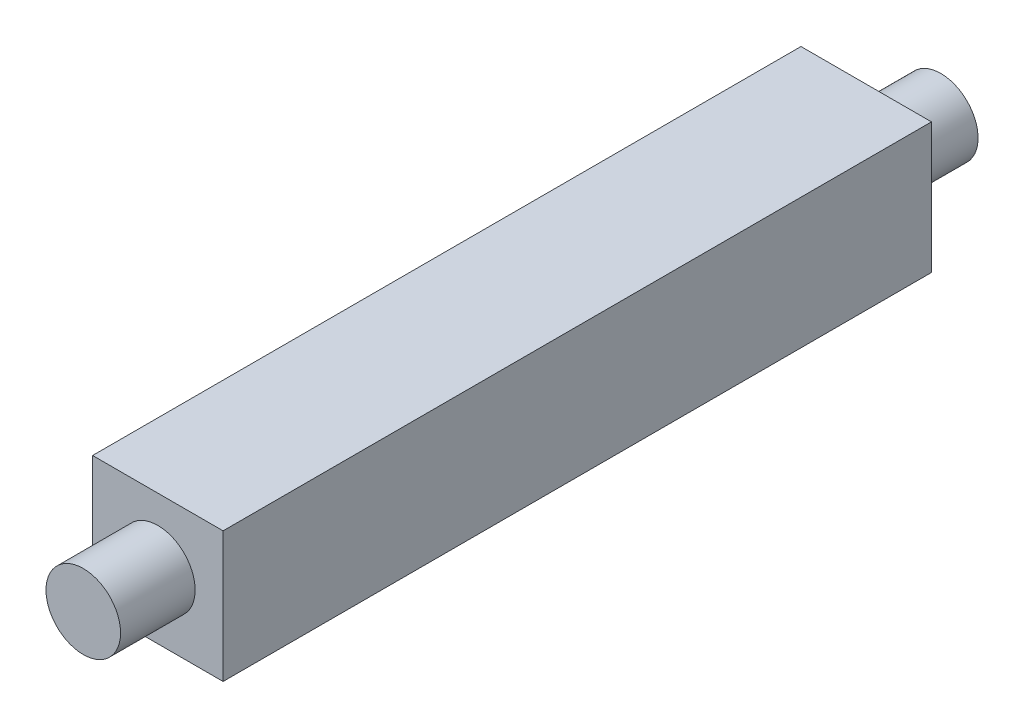
ISO-10303-21;
HEADER;
FILE_DESCRIPTION(('STEP AP214'),'2;1');
FILE_NAME('part.step','',(''),(''),'','','');
FILE_SCHEMA(('AUTOMOTIVE_DESIGN { 1 0 10303 214 1 1 1 1 }'));
ENDSEC;
DATA;
#1=APPLICATION_CONTEXT('core data for automotive mechanical design processes');
#2=APPLICATION_PROTOCOL_DEFINITION('international standard','automotive_design',2000,#1);
#3=PRODUCT_CONTEXT('',#1,'mechanical');
#4=PRODUCT('Part','Part','',(#3));
#5=PRODUCT_RELATED_PRODUCT_CATEGORY('part','',(#4));
#6=PRODUCT_DEFINITION_FORMATION('','',#4);
#7=PRODUCT_DEFINITION_CONTEXT('part definition',#1,'design');
#8=PRODUCT_DEFINITION('design','',#6,#7);
#9=PRODUCT_DEFINITION_SHAPE('','',#8);
#10=(LENGTH_UNIT() NAMED_UNIT(*) SI_UNIT(.MILLI.,.METRE.));
#11=(NAMED_UNIT(*) PLANE_ANGLE_UNIT() SI_UNIT($,.RADIAN.));
#12=(NAMED_UNIT(*) SI_UNIT($,.STERADIAN.) SOLID_ANGLE_UNIT());
#13=UNCERTAINTY_MEASURE_WITH_UNIT(LENGTH_MEASURE(1.E-05),#10,'distance_accuracy_value','');
#14=(GEOMETRIC_REPRESENTATION_CONTEXT(3) GLOBAL_UNCERTAINTY_ASSIGNED_CONTEXT((#13)) GLOBAL_UNIT_ASSIGNED_CONTEXT((#10,
#11,#12)) REPRESENTATION_CONTEXT('',''));
#15=CARTESIAN_POINT('',(0.,0.,0.));
#16=DIRECTION('',(0.,0.,1.));
#17=DIRECTION('',(1.,0.,0.));
#18=AXIS2_PLACEMENT_3D('',#15,#16,#17);
#19=CARTESIAN_POINT('',(1.75,-1.75,19.));
#20=DIRECTION('',(-1.,0.,0.));
#21=DIRECTION('',(0.,0.,1.));
#22=AXIS2_PLACEMENT_3D('',#19,#20,#21);
#23=PLANE('',#22);
#24=DIRECTION('',(0.,1.,0.));
#25=VECTOR('',#24,1.);
#26=CARTESIAN_POINT('',(1.75,-1.75,0.));
#27=LINE('',#26,#25);
#28=CARTESIAN_POINT('',(1.75,-1.75,0.));
#29=VERTEX_POINT('',#28);
#30=CARTESIAN_POINT('',(1.75,1.75,0.));
#31=VERTEX_POINT('',#30);
#32=EDGE_CURVE('E99',#29,#31,#27,.T.);
#33=ORIENTED_EDGE('',*,*,#32,.T.);
#34=DIRECTION('',(0.,0.,-1.));
#35=VECTOR('',#34,1.);
#36=CARTESIAN_POINT('',(1.75,1.75,19.));
#37=LINE('',#36,#35);
#38=CARTESIAN_POINT('',(1.75,1.75,19.));
#39=VERTEX_POINT('',#38);
#40=EDGE_CURVE('E41',#39,#31,#37,.T.);
#41=ORIENTED_EDGE('',*,*,#40,.F.);
#42=DIRECTION('',(0.,1.,0.));
#43=VECTOR('',#42,1.);
#44=CARTESIAN_POINT('',(1.75,-1.75,19.));
#45=LINE('',#44,#43);
#46=CARTESIAN_POINT('',(1.75,-1.75,19.));
#47=VERTEX_POINT('',#46);
#48=EDGE_CURVE('E85',#47,#39,#45,.T.);
#49=ORIENTED_EDGE('',*,*,#48,.F.);
#50=DIRECTION('',(0.,0.,-1.));
#51=VECTOR('',#50,1.);
#52=CARTESIAN_POINT('',(1.75,-1.75,19.));
#53=LINE('',#52,#51);
#54=EDGE_CURVE('E95',#47,#29,#53,.T.);
#55=ORIENTED_EDGE('',*,*,#54,.T.);
#56=EDGE_LOOP('',(#33,#41,#49,#55));
#57=FACE_BOUND('',#56,.T.);
#58=ADVANCED_FACE('F33',(#57),#23,.F.);
#59=CARTESIAN_POINT('',(-1.75,1.75,19.));
#60=DIRECTION('',(0.,-1.,0.));
#61=DIRECTION('',(0.,0.,-1.));
#62=AXIS2_PLACEMENT_3D('',#59,#60,#61);
#63=PLANE('',#62);
#64=DIRECTION('',(-1.,0.,0.));
#65=VECTOR('',#64,1.);
#66=CARTESIAN_POINT('',(-1.75,1.75,0.));
#67=LINE('',#66,#65);
#68=CARTESIAN_POINT('',(-1.75,1.75,0.));
#69=VERTEX_POINT('',#68);
#70=EDGE_CURVE('E90',#31,#69,#67,.T.);
#71=ORIENTED_EDGE('',*,*,#70,.T.);
#72=DIRECTION('',(0.,0.,-1.));
#73=VECTOR('',#72,1.);
#74=CARTESIAN_POINT('',(-1.75,1.75,19.));
#75=LINE('',#74,#73);
#76=CARTESIAN_POINT('',(-1.75,1.75,19.));
#77=VERTEX_POINT('',#76);
#78=EDGE_CURVE('E88',#77,#69,#75,.T.);
#79=ORIENTED_EDGE('',*,*,#78,.F.);
#80=DIRECTION('',(-1.,0.,0.));
#81=VECTOR('',#80,1.);
#82=CARTESIAN_POINT('',(-1.75,1.75,19.));
#83=LINE('',#82,#81);
#84=EDGE_CURVE('E80',#39,#77,#83,.T.);
#85=ORIENTED_EDGE('',*,*,#84,.F.);
#86=ORIENTED_EDGE('',*,*,#40,.T.);
#87=EDGE_LOOP('',(#71,#79,#85,#86));
#88=FACE_BOUND('',#87,.T.);
#89=ADVANCED_FACE('F89',(#88),#63,.F.);
#90=CARTESIAN_POINT('',(-1.75,-1.75,19.));
#91=DIRECTION('',(1.,0.,0.));
#92=DIRECTION('',(0.,0.,-1.));
#93=AXIS2_PLACEMENT_3D('',#90,#91,#92);
#94=PLANE('',#93);
#95=DIRECTION('',(0.,-1.,0.));
#96=VECTOR('',#95,1.);
#97=CARTESIAN_POINT('',(-1.75,-1.75,0.));
#98=LINE('',#97,#96);
#99=CARTESIAN_POINT('',(-1.75,-1.75,0.));
#100=VERTEX_POINT('',#99);
#101=EDGE_CURVE('E66',#69,#100,#98,.T.);
#102=ORIENTED_EDGE('',*,*,#101,.T.);
#103=DIRECTION('',(0.,0.,-1.));
#104=VECTOR('',#103,1.);
#105=CARTESIAN_POINT('',(-1.75,-1.75,19.));
#106=LINE('',#105,#104);
#107=CARTESIAN_POINT('',(-1.75,-1.75,19.));
#108=VERTEX_POINT('',#107);
#109=EDGE_CURVE('E91',#108,#100,#106,.T.);
#110=ORIENTED_EDGE('',*,*,#109,.F.);
#111=DIRECTION('',(0.,-1.,0.));
#112=VECTOR('',#111,1.);
#113=CARTESIAN_POINT('',(-1.75,-1.75,19.));
#114=LINE('',#113,#112);
#115=EDGE_CURVE('E83',#77,#108,#114,.T.);
#116=ORIENTED_EDGE('',*,*,#115,.F.);
#117=ORIENTED_EDGE('',*,*,#78,.T.);
#118=EDGE_LOOP('',(#102,#110,#116,#117));
#119=FACE_BOUND('',#118,.T.);
#120=ADVANCED_FACE('F93',(#119),#94,.F.);
#121=CARTESIAN_POINT('',(-1.75,-1.75,19.));
#122=DIRECTION('',(0.,1.,0.));
#123=DIRECTION('',(0.,0.,1.));
#124=AXIS2_PLACEMENT_3D('',#121,#122,#123);
#125=PLANE('',#124);
#126=DIRECTION('',(1.,0.,0.));
#127=VECTOR('',#126,1.);
#128=CARTESIAN_POINT('',(-1.75,-1.75,0.));
#129=LINE('',#128,#127);
#130=EDGE_CURVE('E72',#100,#29,#129,.T.);
#131=ORIENTED_EDGE('',*,*,#130,.T.);
#132=ORIENTED_EDGE('',*,*,#54,.F.);
#133=DIRECTION('',(1.,0.,0.));
#134=VECTOR('',#133,1.);
#135=CARTESIAN_POINT('',(-1.75,-1.75,19.));
#136=LINE('',#135,#134);
#137=EDGE_CURVE('E49',#108,#47,#136,.T.);
#138=ORIENTED_EDGE('',*,*,#137,.F.);
#139=ORIENTED_EDGE('',*,*,#109,.T.);
#140=EDGE_LOOP('',(#131,#132,#138,#139));
#141=FACE_BOUND('',#140,.T.);
#142=ADVANCED_FACE('F122',(#141),#125,.F.);
#143=CARTESIAN_POINT('',(0.,0.,19.));
#144=DIRECTION('',(0.,0.,-1.));
#145=DIRECTION('',(-1.,0.,0.));
#146=AXIS2_PLACEMENT_3D('',#143,#144,#145);
#147=PLANE('',#146);
#148=CARTESIAN_POINT('',(0.,0.,19.));
#149=DIRECTION('',(0.,0.,-1.));
#150=DIRECTION('',(-1.,0.,0.));
#151=AXIS2_PLACEMENT_3D('',#148,#149,#150);
#152=CIRCLE('',#151,1.);
#153=CARTESIAN_POINT('',(-1.,0.,19.));
#154=VERTEX_POINT('',#153);
#155=EDGE_CURVE('E11',#154,#154,#152,.F.);
#156=ORIENTED_EDGE('',*,*,#155,.F.);
#157=EDGE_LOOP('',(#156));
#158=FACE_BOUND('',#157,.T.);
#159=ORIENTED_EDGE('',*,*,#48,.T.);
#160=ORIENTED_EDGE('',*,*,#84,.T.);
#161=ORIENTED_EDGE('',*,*,#115,.T.);
#162=ORIENTED_EDGE('',*,*,#137,.T.);
#163=EDGE_LOOP('',(#159,#160,#161,#162));
#164=FACE_BOUND('',#163,.T.);
#165=ADVANCED_FACE('F81',(#158,#164),#147,.F.);
#166=CARTESIAN_POINT('',(0.,0.,0.));
#167=DIRECTION('',(0.,0.,-1.));
#168=DIRECTION('',(-1.,0.,0.));
#169=AXIS2_PLACEMENT_3D('',#166,#167,#168);
#170=PLANE('',#169);
#171=CARTESIAN_POINT('',(0.,0.,0.));
#172=DIRECTION('',(0.,0.,-1.));
#173=DIRECTION('',(-1.,0.,0.));
#174=AXIS2_PLACEMENT_3D('',#171,#172,#173);
#175=CIRCLE('',#174,1.);
#176=CARTESIAN_POINT('',(-1.,0.,0.));
#177=VERTEX_POINT('',#176);
#178=EDGE_CURVE('E190',#177,#177,#175,.T.);
#179=ORIENTED_EDGE('',*,*,#178,.F.);
#180=EDGE_LOOP('',(#179));
#181=FACE_BOUND('',#180,.T.);
#182=ORIENTED_EDGE('',*,*,#32,.F.);
#183=ORIENTED_EDGE('',*,*,#130,.F.);
#184=ORIENTED_EDGE('',*,*,#101,.F.);
#185=ORIENTED_EDGE('',*,*,#70,.F.);
#186=EDGE_LOOP('',(#182,#183,#184,#185));
#187=FACE_BOUND('',#186,.T.);
#188=ADVANCED_FACE('F110',(#181,#187),#170,.T.);
#189=CARTESIAN_POINT('',(0.,0.,21.));
#190=DIRECTION('',(0.,0.,-1.));
#191=DIRECTION('',(-1.,0.,0.));
#192=AXIS2_PLACEMENT_3D('',#189,#190,#191);
#193=CYLINDRICAL_SURFACE('',#192,1.);
#194=CARTESIAN_POINT('',(0.,0.,21.));
#195=DIRECTION('',(0.,0.,1.));
#196=DIRECTION('',(1.,0.,0.));
#197=AXIS2_PLACEMENT_3D('',#194,#195,#196);
#198=CIRCLE('',#197,1.);
#199=CARTESIAN_POINT('',(1.,0.,21.));
#200=VERTEX_POINT('',#199);
#201=EDGE_CURVE('E102',#200,#200,#198,.T.);
#202=ORIENTED_EDGE('',*,*,#201,.F.);
#203=EDGE_LOOP('',(#202));
#204=FACE_BOUND('',#203,.T.);
#205=ORIENTED_EDGE('',*,*,#155,.T.);
#206=EDGE_LOOP('',(#205));
#207=FACE_BOUND('',#206,.T.);
#208=ADVANCED_FACE('F112',(#204,#207),#193,.T.);
#209=CARTESIAN_POINT('',(0.,0.,21.));
#210=DIRECTION('',(0.,0.,1.));
#211=DIRECTION('',(1.,0.,0.));
#212=AXIS2_PLACEMENT_3D('',#209,#210,#211);
#213=PLANE('',#212);
#214=ORIENTED_EDGE('',*,*,#201,.T.);
#215=EDGE_LOOP('',(#214));
#216=FACE_BOUND('',#215,.T.);
#217=ADVANCED_FACE('F119',(#216),#213,.T.);
#218=CARTESIAN_POINT('',(0.,0.,-2.));
#219=DIRECTION('',(0.,0.,1.));
#220=DIRECTION('',(1.,0.,0.));
#221=AXIS2_PLACEMENT_3D('',#218,#219,#220);
#222=CYLINDRICAL_SURFACE('',#221,1.);
#223=CARTESIAN_POINT('',(0.,0.,-2.));
#224=DIRECTION('',(0.,0.,-1.));
#225=DIRECTION('',(-1.,0.,0.));
#226=AXIS2_PLACEMENT_3D('',#223,#224,#225);
#227=CIRCLE('',#226,1.);
#228=CARTESIAN_POINT('',(-1.,0.,-2.));
#229=VERTEX_POINT('',#228);
#230=EDGE_CURVE('E189',#229,#229,#227,.T.);
#231=ORIENTED_EDGE('',*,*,#230,.F.);
#232=EDGE_LOOP('',(#231));
#233=FACE_BOUND('',#232,.T.);
#234=ORIENTED_EDGE('',*,*,#178,.T.);
#235=EDGE_LOOP('',(#234));
#236=FACE_BOUND('',#235,.T.);
#237=ADVANCED_FACE('F159',(#233,#236),#222,.T.);
#238=CARTESIAN_POINT('',(0.,0.,-2.));
#239=DIRECTION('',(0.,0.,-1.));
#240=DIRECTION('',(-1.,0.,0.));
#241=AXIS2_PLACEMENT_3D('',#238,#239,#240);
#242=PLANE('',#241);
#243=ORIENTED_EDGE('',*,*,#230,.T.);
#244=EDGE_LOOP('',(#243));
#245=FACE_BOUND('',#244,.T.);
#246=ADVANCED_FACE('F173',(#245),#242,.T.);
#247=CLOSED_SHELL('',(#58,#89,#120,#142,#165,#188,#208,#217,#237,#246));
#248=MANIFOLD_SOLID_BREP('B2',#247);
#249=ADVANCED_BREP_SHAPE_REPRESENTATION('',(#18,#248),#14);
#250=SHAPE_DEFINITION_REPRESENTATION(#9,#249);
ENDSEC;
END-ISO-10303-21;
